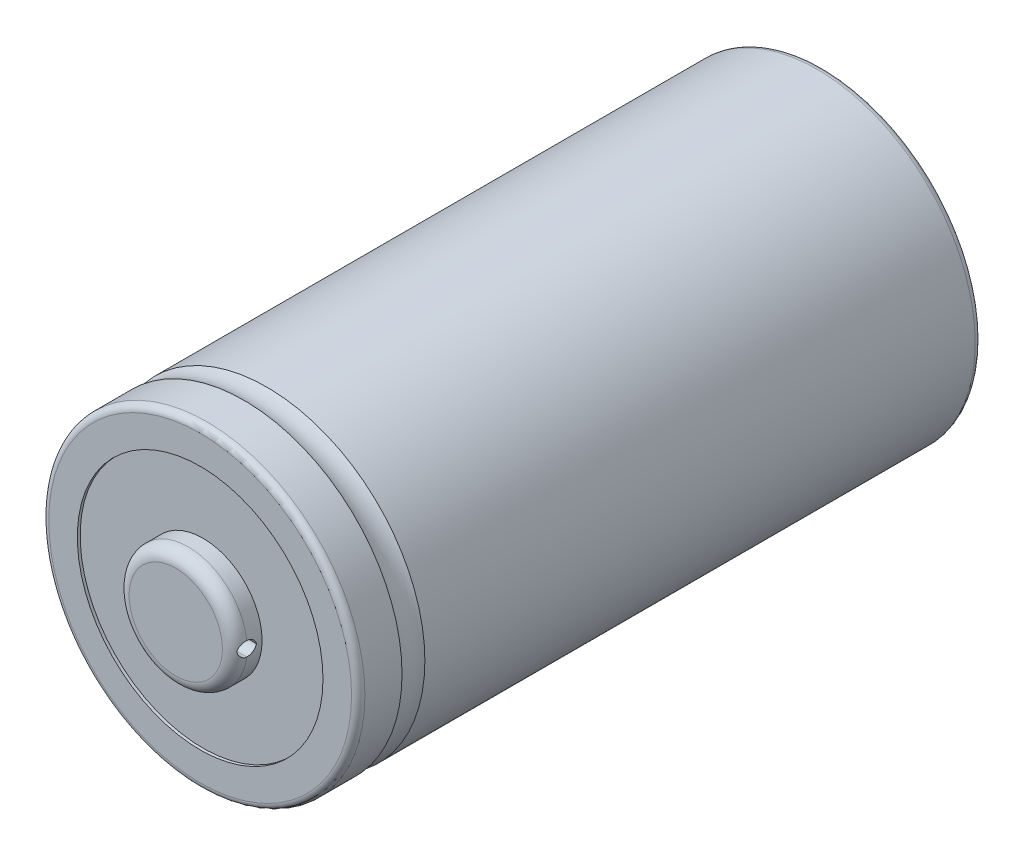
ISO-10303-21;
HEADER;
FILE_DESCRIPTION(('STEP AP214'),'2;1');
FILE_NAME('part.step','',(''),(''),'','','');
FILE_SCHEMA(('AUTOMOTIVE_DESIGN { 1 0 10303 214 1 1 1 1 }'));
ENDSEC;
DATA;
#1=APPLICATION_CONTEXT('core data for automotive mechanical design processes');
#2=APPLICATION_PROTOCOL_DEFINITION('international standard','automotive_design',2000,#1);
#3=PRODUCT_CONTEXT('',#1,'mechanical');
#4=PRODUCT('Part','Part','',(#3));
#5=PRODUCT_RELATED_PRODUCT_CATEGORY('part','',(#4));
#6=PRODUCT_DEFINITION_FORMATION('','',#4);
#7=PRODUCT_DEFINITION_CONTEXT('part definition',#1,'design');
#8=PRODUCT_DEFINITION('design','',#6,#7);
#9=PRODUCT_DEFINITION_SHAPE('','',#8);
#10=(LENGTH_UNIT() NAMED_UNIT(*) SI_UNIT(.MILLI.,.METRE.));
#11=(NAMED_UNIT(*) PLANE_ANGLE_UNIT() SI_UNIT($,.RADIAN.));
#12=(NAMED_UNIT(*) SI_UNIT($,.STERADIAN.) SOLID_ANGLE_UNIT());
#13=UNCERTAINTY_MEASURE_WITH_UNIT(LENGTH_MEASURE(1.E-05),#10,'distance_accuracy_value','');
#14=(GEOMETRIC_REPRESENTATION_CONTEXT(3) GLOBAL_UNCERTAINTY_ASSIGNED_CONTEXT((#13)) GLOBAL_UNIT_ASSIGNED_CONTEXT((#10,
#11,#12)) REPRESENTATION_CONTEXT('',''));
#15=CARTESIAN_POINT('',(0.,0.,0.));
#16=DIRECTION('',(0.,0.,1.));
#17=DIRECTION('',(1.,0.,0.));
#18=AXIS2_PLACEMENT_3D('',#15,#16,#17);
#19=CARTESIAN_POINT('',(0.,0.,44.0781240867132));
#20=DIRECTION('',(0.,0.,-1.));
#21=DIRECTION('',(-1.,0.,0.));
#22=AXIS2_PLACEMENT_3D('',#19,#20,#21);
#23=CYLINDRICAL_SURFACE('',#22,3.1);
#24=CARTESIAN_POINT('',(0.,0.,33.38));
#25=DIRECTION('',(0.,0.,1.));
#26=DIRECTION('',(1.,0.,0.));
#27=AXIS2_PLACEMENT_3D('',#24,#25,#26);
#28=CIRCLE('',#27,3.1);
#29=CARTESIAN_POINT('',(3.07723496015498,-0.375000000000001,33.38));
#30=VERTEX_POINT('',#29);
#31=CARTESIAN_POINT('',(-3.07723496015498,-0.375000000000001,33.38));
#32=VERTEX_POINT('',#31);
#33=EDGE_CURVE('E106',#30,#32,#28,.F.);
#34=ORIENTED_EDGE('',*,*,#33,.T.);
#35=CARTESIAN_POINT('',(-3.07723496015498,-0.375000000000001,33.38));
#36=CARTESIAN_POINT('',(-3.07722108964524,-0.37502431119088,33.3519675359304));
#37=CARTESIAN_POINT('',(-3.07752190263624,-0.372644060289489,33.32394489367));
#38=CARTESIAN_POINT('',(-3.07864973757918,-0.36325722162575,33.2687270510573));
#39=CARTESIAN_POINT('',(-3.07947617231636,-0.35625579622366,33.2415309627748));
#40=CARTESIAN_POINT('',(-3.08155286971449,-0.337805540782092,33.1886991276051));
#41=CARTESIAN_POINT('',(-3.0828032752883,-0.326355210907788,33.1630639103005));
#42=CARTESIAN_POINT('',(-3.08554349645924,-0.299342894087063,33.1140770740933));
#43=CARTESIAN_POINT('',(-3.08703330170583,-0.283781084883623,33.0907253565327));
#44=CARTESIAN_POINT('',(-3.09004176139488,-0.248894857892252,33.0468452198899));
#45=CARTESIAN_POINT('',(-3.09156051895574,-0.229552992853834,33.0263306760024));
#46=CARTESIAN_POINT('',(-3.0943840028743,-0.187688391438738,32.988827773696));
#47=CARTESIAN_POINT('',(-3.09568869525859,-0.165165151212497,32.971839974879));
#48=CARTESIAN_POINT('',(-3.09786210989986,-0.117551002107083,32.9418660448252));
#49=CARTESIAN_POINT('',(-3.09873044168488,-0.0924578176254112,32.9288835016384));
#50=CARTESIAN_POINT('',(-3.09984507875116,-0.0404388430265554,32.9073253160016));
#51=CARTESIAN_POINT('',(-3.1000917758696,-0.0135142183264924,32.8987469001993));
#52=CARTESIAN_POINT('',(-3.09988702075,0.0321442171049149,32.8883417535016));
#53=CARTESIAN_POINT('',(-3.09964213798515,0.0505933875030443,32.8852152181896));
#54=CARTESIAN_POINT('',(-3.09881544336478,0.0876947316520287,32.8810441442412));
#55=CARTESIAN_POINT('',(-3.09823405235983,0.106346623333572,32.8799970122551));
#56=CARTESIAN_POINT('',(-3.09747881348687,0.124999999999999,32.88));
#57=B_SPLINE_CURVE_WITH_KNOTS('',3,(#35,#36,#37,#38,#39,#40,#41,#42,#43,#44,#45,#46,#47,#48,#49,
#50,#51,#52,#53,#54,#55,#56),.UNSPECIFIED.,.F.,.F.,(4,2,2,2,2,2,2,2,2,2,4),(0.,
0.0839803673878672,0.167867077891062,0.251782093234397,0.335693481448919,0.4200017304861,
0.504323346825369,0.588720283570846,0.673064008773517,0.729093206450725,0.785052482732773),.UNSPECIFIED.);
#58=CARTESIAN_POINT('',(-3.10000000000004,5.42671774380772E-13,32.895877081724));
#59=VERTEX_POINT('',#58);
#60=EDGE_CURVE('E14',#32,#59,#57,.T.);
#61=ORIENTED_EDGE('',*,*,#60,.T.);
#62=CARTESIAN_POINT('',(-3.09747881348687,-0.125000000000001,32.88));
#63=CARTESIAN_POINT('',(-3.09861651009824,-0.0971623136353558,32.8799746789222));
#64=CARTESIAN_POINT('',(-3.0993504478092,-0.0693169063857497,32.8823233265536));
#65=CARTESIAN_POINT('',(-3.10008403812204,-0.0144214692714766,32.8915949882362));
#66=CARTESIAN_POINT('',(-3.10008457103918,0.0126294751774171,32.8985125082277));
#67=CARTESIAN_POINT('',(-3.09942683113484,0.0652061208349664,32.9167527016929));
#68=CARTESIAN_POINT('',(-3.09876829775109,0.0907312145679851,32.9280771163529));
#69=CARTESIAN_POINT('',(-3.09695440912784,0.139529820426052,32.9547972721709));
#70=CARTESIAN_POINT('',(-3.09579907639678,0.162803434500159,32.9701928288658));
#71=CARTESIAN_POINT('',(-3.09318789324821,0.206574848877496,33.0047144602662));
#72=CARTESIAN_POINT('',(-3.09173050957152,0.227057566723044,33.0238595397373));
#73=CARTESIAN_POINT('',(-3.08874907732761,0.264543975757543,33.0652998292728));
#74=CARTESIAN_POINT('',(-3.08722501473765,0.281546930833944,33.0875957041769));
#75=CARTESIAN_POINT('',(-3.08432630891288,0.311710421023912,33.1348942164361));
#76=CARTESIAN_POINT('',(-3.08295286659649,0.324841311337272,33.1599158252033));
#77=CARTESIAN_POINT('',(-3.08057070689916,0.346707029091669,33.211820530607));
#78=CARTESIAN_POINT('',(-3.07956177339674,0.355444462672146,33.2387025129021));
#79=CARTESIAN_POINT('',(-3.07829504603471,0.366222709143249,33.2847741958251));
#80=CARTESIAN_POINT('',(-3.0779002591024,0.369511132572404,33.30367780474));
#81=CARTESIAN_POINT('',(-3.07736900719374,0.373900120727669,33.3417181781828));
#82=CARTESIAN_POINT('',(-3.07723223850545,0.375003257819717,33.3608546418681));
#83=CARTESIAN_POINT('',(-3.07723496015498,0.374999999999999,33.38));
#84=B_SPLINE_CURVE_WITH_KNOTS('',3,(#62,#63,#64,#65,#66,#67,#68,#69,#70,#71,#72,#73,#74,#75,#76,
#77,#78,#79,#80,#81,#82,#83),.UNSPECIFIED.,.F.,.F.,(4,2,2,2,2,2,2,2,2,2,4),(0.,
0.0834682744861935,0.166836360835152,0.250237419834706,0.333634700588622,0.417466169679393,
0.501315354275548,0.585790751923024,0.670215980611678,0.727670408798062,0.785057165374741),.UNSPECIFIED.);
#85=CARTESIAN_POINT('',(-3.07723496015499,0.374999999999999,33.38));
#86=VERTEX_POINT('',#85);
#87=EDGE_CURVE('E111',#59,#86,#84,.T.);
#88=ORIENTED_EDGE('',*,*,#87,.T.);
#89=CARTESIAN_POINT('',(3.07723496015503,0.374999999999999,33.38));
#90=VERTEX_POINT('',#89);
#91=EDGE_CURVE('E130',#86,#90,#28,.F.);
#92=ORIENTED_EDGE('',*,*,#91,.T.);
#93=CARTESIAN_POINT('',(3.07723496015498,0.374999999999999,33.38));
#94=CARTESIAN_POINT('',(3.07722108964524,0.375024311190879,33.3519675359304));
#95=CARTESIAN_POINT('',(3.07752190263624,0.372644060289488,33.32394489367));
#96=CARTESIAN_POINT('',(3.07864973757918,0.363257221625748,33.2687270510573));
#97=CARTESIAN_POINT('',(3.07947617231636,0.356255796223658,33.2415309627748));
#98=CARTESIAN_POINT('',(3.08155286971449,0.337805540782091,33.1886991276051));
#99=CARTESIAN_POINT('',(3.0828032752883,0.326355210907786,33.1630639103005));
#100=CARTESIAN_POINT('',(3.08554349645924,0.299342894087061,33.1140770740933));
#101=CARTESIAN_POINT('',(3.08703330170583,0.283781084883622,33.0907253565327));
#102=CARTESIAN_POINT('',(3.09004176139488,0.248894857892251,33.0468452198899));
#103=CARTESIAN_POINT('',(3.09156051895574,0.229552992853832,33.0263306760024));
#104=CARTESIAN_POINT('',(3.0943840028743,0.187688391438736,32.988827773696));
#105=CARTESIAN_POINT('',(3.09568869525859,0.165165151212495,32.971839974879));
#106=CARTESIAN_POINT('',(3.09786210989986,0.117551002107082,32.9418660448252));
#107=CARTESIAN_POINT('',(3.09873044168488,0.0924578176254095,32.9288835016384));
#108=CARTESIAN_POINT('',(3.09984507875116,0.0404388430265537,32.9073253160016));
#109=CARTESIAN_POINT('',(3.1000917758696,0.0135142183264907,32.8987469001993));
#110=CARTESIAN_POINT('',(3.09988702075,-0.0321442171049166,32.8883417535016));
#111=CARTESIAN_POINT('',(3.09964213798515,-0.050593387503046,32.8852152181896));
#112=CARTESIAN_POINT('',(3.09881544336478,-0.0876947316520304,32.8810441442412));
#113=CARTESIAN_POINT('',(3.09823405235983,-0.106346623333573,32.8799970122551));
#114=CARTESIAN_POINT('',(3.09747881348687,-0.125,32.88));
#115=B_SPLINE_CURVE_WITH_KNOTS('',3,(#93,#94,#95,#96,#97,#98,#99,#100,#101,#102,#103,#104,#105,
#106,#107,#108,#109,#110,#111,#112,#113,#114),.UNSPECIFIED.,.F.,.F.,(4,2,2,2,2,2,2,2,2,2,4),(0.,
0.0839803673878672,0.167867077891062,0.251782093234397,0.335693481448919,0.4200017304861,
0.504323346825369,0.588720283570846,0.673064008773517,0.729093206450725,0.785052482732773),.UNSPECIFIED.);
#116=CARTESIAN_POINT('',(3.1,0.,32.8958770817241));
#117=VERTEX_POINT('',#116);
#118=EDGE_CURVE('E87',#90,#117,#115,.T.);
#119=ORIENTED_EDGE('',*,*,#118,.T.);
#120=CARTESIAN_POINT('',(3.09747881348687,0.124999999999999,32.88));
#121=CARTESIAN_POINT('',(3.09861651009824,0.0971623136353541,32.8799746789222));
#122=CARTESIAN_POINT('',(3.0993504478092,0.069316906385748,32.8823233265536));
#123=CARTESIAN_POINT('',(3.10008403812204,0.0144214692714749,32.8915949882362));
#124=CARTESIAN_POINT('',(3.10008457103918,-0.0126294751774188,32.8985125082277));
#125=CARTESIAN_POINT('',(3.09942683113484,-0.0652061208349681,32.9167527016929));
#126=CARTESIAN_POINT('',(3.09876829775109,-0.0907312145679868,32.9280771163529));
#127=CARTESIAN_POINT('',(3.09695440912784,-0.139529820426054,32.9547972721709));
#128=CARTESIAN_POINT('',(3.09579907639678,-0.162803434500161,32.9701928288658));
#129=CARTESIAN_POINT('',(3.09318789324821,-0.206574848877497,33.0047144602662));
#130=CARTESIAN_POINT('',(3.09173050957152,-0.227057566723045,33.0238595397373));
#131=CARTESIAN_POINT('',(3.08874907732761,-0.264543975757544,33.0652998292728));
#132=CARTESIAN_POINT('',(3.08722501473765,-0.281546930833945,33.0875957041769));
#133=CARTESIAN_POINT('',(3.08432630891288,-0.311710421023914,33.1348942164361));
#134=CARTESIAN_POINT('',(3.08295286659649,-0.324841311337273,33.1599158252033));
#135=CARTESIAN_POINT('',(3.08057070689916,-0.34670702909167,33.211820530607));
#136=CARTESIAN_POINT('',(3.07956177339674,-0.355444462672147,33.2387025129021));
#137=CARTESIAN_POINT('',(3.07829504603471,-0.366222709143251,33.2847741958251));
#138=CARTESIAN_POINT('',(3.0779002591024,-0.369511132572406,33.30367780474));
#139=CARTESIAN_POINT('',(3.07736900719374,-0.373900120727671,33.3417181781828));
#140=CARTESIAN_POINT('',(3.07723223850545,-0.375003257819719,33.3608546418681));
#141=CARTESIAN_POINT('',(3.07723496015498,-0.375000000000001,33.38));
#142=B_SPLINE_CURVE_WITH_KNOTS('',3,(#120,#121,#122,#123,#124,#125,#126,#127,#128,#129,#130,
#131,#132,#133,#134,#135,#136,#137,#138,#139,#140,#141),.UNSPECIFIED.,.F.,.F.,(4,2,2,2,2,2,2,2,
2,2,4),(0.,0.0834682744861935,0.166836360835152,0.250237419834706,0.333634700588622,
0.417466169679393,0.501315354275548,0.585790751923024,0.670215980611678,0.727670408798062,
0.785057165374741),.UNSPECIFIED.);
#143=EDGE_CURVE('E75',#117,#30,#142,.T.);
#144=ORIENTED_EDGE('',*,*,#143,.T.);
#145=EDGE_LOOP('',(#34,#61,#88,#92,#119,#144));
#146=FACE_BOUND('',#145,.T.);
#147=CARTESIAN_POINT('',(0.,0.,32.6));
#148=DIRECTION('',(0.,0.,1.));
#149=DIRECTION('',(1.,0.,0.));
#150=AXIS2_PLACEMENT_3D('',#147,#148,#149);
#151=CIRCLE('',#150,3.1);
#152=CARTESIAN_POINT('',(3.1,0.,32.6));
#153=VERTEX_POINT('',#152);
#154=EDGE_CURVE('E213',#153,#153,#151,.T.);
#155=ORIENTED_EDGE('',*,*,#154,.T.);
#156=EDGE_LOOP('',(#155));
#157=FACE_BOUND('',#156,.T.);
#158=ADVANCED_FACE('F65',(#146,#157),#23,.T.);
#159=CARTESIAN_POINT('',(0.,0.,32.6));
#160=DIRECTION('',(0.,0.,1.));
#161=DIRECTION('',(1.,0.,0.));
#162=AXIS2_PLACEMENT_3D('',#159,#160,#161);
#163=PLANE('',#162);
#164=ORIENTED_EDGE('',*,*,#154,.F.);
#165=EDGE_LOOP('',(#164));
#166=FACE_BOUND('',#165,.T.);
#167=ADVANCED_FACE('F197',(#166),#163,.F.);
#168=CARTESIAN_POINT('',(0.,0.,34.03));
#169=DIRECTION('',(0.,0.,1.));
#170=DIRECTION('',(1.,0.,0.));
#171=AXIS2_PLACEMENT_3D('',#168,#169,#170);
#172=PLANE('',#171);
#173=CARTESIAN_POINT('',(0.,0.,34.03));
#174=DIRECTION('',(0.,0.,1.));
#175=DIRECTION('',(1.,0.,0.));
#176=AXIS2_PLACEMENT_3D('',#173,#174,#175);
#177=CIRCLE('',#176,2.45);
#178=CARTESIAN_POINT('',(2.45,0.,34.03));
#179=VERTEX_POINT('',#178);
#180=EDGE_CURVE('E214',#179,#179,#177,.T.);
#181=ORIENTED_EDGE('',*,*,#180,.T.);
#182=EDGE_LOOP('',(#181));
#183=FACE_BOUND('',#182,.T.);
#184=ADVANCED_FACE('F154',(#183),#172,.T.);
#185=CARTESIAN_POINT('',(0.,0.,33.38));
#186=DIRECTION('',(0.,0.,1.));
#187=DIRECTION('',(1.,0.,0.));
#188=AXIS2_PLACEMENT_3D('',#185,#186,#187);
#189=TOROIDAL_SURFACE('',#188,2.45,0.65);
#190=ORIENTED_EDGE('',*,*,#91,.F.);
#191=CARTESIAN_POINT('',(-3.07723496015499,0.374999999999999,33.38));
#192=CARTESIAN_POINT('',(-3.0772590507192,0.375024823588249,33.401064686639));
#193=CARTESIAN_POINT('',(-3.07640744153031,0.373337950315937,33.4221032987817));
#194=CARTESIAN_POINT('',(-3.07314125702718,0.366747756603703,33.4634539921918));
#195=CARTESIAN_POINT('',(-3.07073361086126,0.36185869445875,33.4837688751525));
#196=CARTESIAN_POINT('',(-3.06454372897254,0.349073939244649,33.523175498742));
#197=CARTESIAN_POINT('',(-3.06076280754444,0.341181120580212,33.5422683883994));
#198=CARTESIAN_POINT('',(-3.05213509365533,0.322682969406967,33.578838329204));
#199=CARTESIAN_POINT('',(-3.04728742575331,0.312075407832498,33.5963140363557));
#200=CARTESIAN_POINT('',(-3.03660375612171,0.28778723211792,33.6302477306299));
#201=CARTESIAN_POINT('',(-3.03072747222377,0.273967208361113,33.6465929966448));
#202=CARTESIAN_POINT('',(-3.01869499053535,0.243955787853043,33.6768459721595));
#203=CARTESIAN_POINT('',(-3.01253849026637,0.227761784550943,33.6907509649694));
#204=CARTESIAN_POINT('',(-2.99997854541977,0.191740547747157,33.7169922283487));
#205=CARTESIAN_POINT('',(-2.99360275145199,0.171717488329132,33.7290746459123));
#206=CARTESIAN_POINT('',(-2.98205864838753,0.129623560367935,33.7496460750387));
#207=CARTESIAN_POINT('',(-2.97688726286513,0.107558114963935,33.7581442878495));
#208=CARTESIAN_POINT('',(-2.96957551308347,0.0671258078864857,33.7696754911881));
#209=CARTESIAN_POINT('',(-2.967012642919,0.0490652112247237,33.773513401851));
#210=CARTESIAN_POINT('',(-2.96340407662236,0.0123540007983645,33.7786897300325));
#211=CARTESIAN_POINT('',(-2.96236598690248,-0.00629909997052142,33.7800156257431));
#212=CARTESIAN_POINT('',(-2.9622420457586,-0.0249999999999984,33.78));
#213=B_SPLINE_CURVE_WITH_KNOTS('',3,(#191,#192,#193,#194,#195,#196,#197,#198,#199,#200,#201,
#202,#203,#204,#205,#206,#207,#208,#209,#210,#211,#212),.UNSPECIFIED.,.F.,.F.,(4,2,2,2,2,2,2,2,
2,2,4),(0.,0.0630684694461883,0.125858007565663,0.188587610547441,0.251368886764664,
0.317685398495476,0.384075276614335,0.456440856219382,0.528619513629262,0.58431320872704,
0.640283800848986),.UNSPECIFIED.);
#214=CARTESIAN_POINT('',(-2.96295711321828,-1.93028947010796E-11,33.7792179855656));
#215=VERTEX_POINT('',#214);
#216=EDGE_CURVE('E159',#86,#215,#213,.T.);
#217=ORIENTED_EDGE('',*,*,#216,.T.);
#218=CARTESIAN_POINT('',(-2.9622420457586,0.0249999999999991,33.78));
#219=CARTESIAN_POINT('',(-2.96236776154865,0.0041508070441296,33.7800242912142));
#220=CARTESIAN_POINT('',(-2.96364620008122,-0.0166322823187571,33.7783722477045));
#221=CARTESIAN_POINT('',(-2.96806276316335,-0.0573686676837246,33.7719592414631));
#222=CARTESIAN_POINT('',(-2.97118787803089,-0.0773267335301356,33.7672200040728));
#223=CARTESIAN_POINT('',(-2.97885477573924,-0.115965605616805,33.7548881428554));
#224=CARTESIAN_POINT('',(-2.98339246544792,-0.134649914458808,33.747303750404));
#225=CARTESIAN_POINT('',(-2.99332529995938,-0.170524159135407,33.7295305248176));
#226=CARTESIAN_POINT('',(-2.99872214287593,-0.187711028954692,33.7193365089853));
#227=CARTESIAN_POINT('',(-3.01040847829504,-0.221974378088852,33.6954103445415));
#228=CARTESIAN_POINT('',(-3.01673291270941,-0.238861489826141,33.6814236496848));
#229=CARTESIAN_POINT('',(-3.02914686668606,-0.270175412685932,33.6508330598623));
#230=CARTESIAN_POINT('',(-3.03523636240873,-0.284601974637972,33.634228900163));
#231=CARTESIAN_POINT('',(-3.04699632334387,-0.311480644974977,33.5975540855449));
#232=CARTESIAN_POINT('',(-3.05261500608103,-0.323747227159621,33.5773295610169));
#233=CARTESIAN_POINT('',(-3.0623817059394,-0.344608506917349,33.534757137163));
#234=CARTESIAN_POINT('',(-3.06653185876548,-0.353208540569314,33.5124123818402));
#235=CARTESIAN_POINT('',(-3.07216793075783,-0.36477294799791,33.4717221940472));
#236=CARTESIAN_POINT('',(-3.07405061935064,-0.368586467358285,33.4536696973741));
#237=CARTESIAN_POINT('',(-3.07659238127824,-0.373709732064341,33.4170856546874));
#238=CARTESIAN_POINT('',(-3.07724846839099,-0.375013367201711,33.3985530506364));
#239=CARTESIAN_POINT('',(-3.07723496015498,-0.375000000000001,33.38));
#240=B_SPLINE_CURVE_WITH_KNOTS('',3,(#218,#219,#220,#221,#222,#223,#224,#225,#226,#227,#228,
#229,#230,#231,#232,#233,#234,#235,#236,#237,#238,#239),.UNSPECIFIED.,.F.,.F.,(4,2,2,2,2,2,2,2,
2,2,4),(0.,0.0623656226013925,0.124297036380257,0.186050639925231,0.247927850326597,
0.316104472169852,0.38428799390485,0.456836509577251,0.529279078981418,0.584711160322038,
0.640278018956382),.UNSPECIFIED.);
#241=EDGE_CURVE('E124',#215,#32,#240,.T.);
#242=ORIENTED_EDGE('',*,*,#241,.T.);
#243=ORIENTED_EDGE('',*,*,#33,.F.);
#244=CARTESIAN_POINT('',(3.07723496015498,-0.375000000000001,33.38));
#245=CARTESIAN_POINT('',(3.07725905071919,-0.375024823588251,33.401064686639));
#246=CARTESIAN_POINT('',(3.07640744153031,-0.373337950315939,33.4221032987817));
#247=CARTESIAN_POINT('',(3.07314125702718,-0.366747756603704,33.4634539921918));
#248=CARTESIAN_POINT('',(3.07073361086126,-0.361858694458751,33.4837688751525));
#249=CARTESIAN_POINT('',(3.06454372897254,-0.349073939244651,33.523175498742));
#250=CARTESIAN_POINT('',(3.06076280754444,-0.341181120580214,33.5422683883994));
#251=CARTESIAN_POINT('',(3.05213509365533,-0.322682969406969,33.578838329204));
#252=CARTESIAN_POINT('',(3.04728742575331,-0.3120754078325,33.5963140363557));
#253=CARTESIAN_POINT('',(3.03660375612171,-0.287787232117922,33.6302477306299));
#254=CARTESIAN_POINT('',(3.03072747222377,-0.273967208361114,33.6465929966448));
#255=CARTESIAN_POINT('',(3.01869499053535,-0.243955787853045,33.6768459721595));
#256=CARTESIAN_POINT('',(3.01253849026637,-0.227761784550944,33.6907509649694));
#257=CARTESIAN_POINT('',(2.99997854541977,-0.191740547747158,33.7169922283487));
#258=CARTESIAN_POINT('',(2.99360275145199,-0.171717488329134,33.7290746459123));
#259=CARTESIAN_POINT('',(2.98205864838753,-0.129623560367936,33.7496460750387));
#260=CARTESIAN_POINT('',(2.97688726286513,-0.107558114963936,33.7581442878495));
#261=CARTESIAN_POINT('',(2.96957551308347,-0.0671258078864865,33.7696754911881));
#262=CARTESIAN_POINT('',(2.967012642919,-0.049065211224724,33.773513401851));
#263=CARTESIAN_POINT('',(2.96340407662236,-0.0123540007983654,33.7786897300325));
#264=CARTESIAN_POINT('',(2.96236598690248,0.0062990999705196,33.7800156257431));
#265=CARTESIAN_POINT('',(2.9622420457586,0.0249999999999967,33.78));
#266=B_SPLINE_CURVE_WITH_KNOTS('',3,(#244,#245,#246,#247,#248,#249,#250,#251,#252,#253,#254,
#255,#256,#257,#258,#259,#260,#261,#262,#263,#264,#265),.UNSPECIFIED.,.F.,.F.,(4,2,2,2,2,2,2,2,
2,2,4),(0.,0.0630684694461877,0.125858007565663,0.188587610547441,0.251368886764663,
0.317685398495476,0.384075276614335,0.456440856219382,0.528619513629261,0.584313208727042,
0.640283800848986),.UNSPECIFIED.);
#267=CARTESIAN_POINT('',(2.96295711321734,0.,33.7792179855668));
#268=VERTEX_POINT('',#267);
#269=EDGE_CURVE('E115',#30,#268,#266,.T.);
#270=ORIENTED_EDGE('',*,*,#269,.T.);
#271=CARTESIAN_POINT('',(2.9622420457586,-0.0250000000000008,33.78));
#272=CARTESIAN_POINT('',(2.96236776154865,-0.0041508070441314,33.7800242912142));
#273=CARTESIAN_POINT('',(2.96364620008122,0.0166322823187554,33.7783722477045));
#274=CARTESIAN_POINT('',(2.96806276316335,0.0573686676837229,33.7719592414631));
#275=CARTESIAN_POINT('',(2.97118787803089,0.077326733530134,33.7672200040728));
#276=CARTESIAN_POINT('',(2.97885477573924,0.115965605616803,33.7548881428554));
#277=CARTESIAN_POINT('',(2.98339246544792,0.134649914458807,33.747303750404));
#278=CARTESIAN_POINT('',(2.99332529995938,0.170524159135405,33.7295305248176));
#279=CARTESIAN_POINT('',(2.99872214287593,0.187711028954691,33.7193365089853));
#280=CARTESIAN_POINT('',(3.01040847829504,0.22197437808885,33.6954103445415));
#281=CARTESIAN_POINT('',(3.01673291270941,0.238861489826139,33.6814236496848));
#282=CARTESIAN_POINT('',(3.02914686668606,0.27017541268593,33.6508330598623));
#283=CARTESIAN_POINT('',(3.03523636240873,0.28460197463797,33.634228900163));
#284=CARTESIAN_POINT('',(3.04699632334387,0.311480644974975,33.5975540855449));
#285=CARTESIAN_POINT('',(3.05261500608103,0.323747227159619,33.5773295610169));
#286=CARTESIAN_POINT('',(3.0623817059394,0.344608506917347,33.534757137163));
#287=CARTESIAN_POINT('',(3.06653185876548,0.353208540569313,33.5124123818402));
#288=CARTESIAN_POINT('',(3.07216793075783,0.364772947997908,33.4717221940472));
#289=CARTESIAN_POINT('',(3.07405061935064,0.368586467358284,33.4536696973741));
#290=CARTESIAN_POINT('',(3.07659238127825,0.37370973206434,33.4170856546874));
#291=CARTESIAN_POINT('',(3.07724846839099,0.37501336720171,33.3985530506364));
#292=CARTESIAN_POINT('',(3.07723496015498,0.374999999999999,33.38));
#293=B_SPLINE_CURVE_WITH_KNOTS('',3,(#271,#272,#273,#274,#275,#276,#277,#278,#279,#280,#281,
#282,#283,#284,#285,#286,#287,#288,#289,#290,#291,#292),.UNSPECIFIED.,.F.,.F.,(4,2,2,2,2,2,2,2,
2,2,4),(0.,0.0623656226013926,0.124297036380257,0.186050639925231,0.247927850326598,
0.316104472169852,0.38428799390485,0.456836509577251,0.529279078981418,0.584711160322045,
0.640278018956389),.UNSPECIFIED.);
#294=EDGE_CURVE('E166',#268,#90,#293,.T.);
#295=ORIENTED_EDGE('',*,*,#294,.T.);
#296=EDGE_LOOP('',(#190,#217,#242,#243,#270,#295));
#297=FACE_BOUND('',#296,.T.);
#298=ORIENTED_EDGE('',*,*,#180,.F.);
#299=EDGE_LOOP('',(#298));
#300=FACE_BOUND('',#299,.T.);
#301=ADVANCED_FACE('F128',(#297,#300),#189,.T.);
#302=CARTESIAN_POINT('',(-8.3,-0.0250000000000008,33.38));
#303=DIRECTION('',(-1.,0.,0.));
#304=DIRECTION('',(0.,0.,1.));
#305=AXIS2_PLACEMENT_3D('',#302,#303,#304);
#306=CYLINDRICAL_SURFACE('',#305,0.4);
#307=DIRECTION('',(-1.,0.,0.));
#308=VECTOR('',#307,1.);
#309=CARTESIAN_POINT('',(0.,0.,33.7792179855668));
#310=LINE('',#309,#308);
#311=EDGE_CURVE('E120',#215,#268,#310,.F.);
#312=ORIENTED_EDGE('',*,*,#311,.F.);
#313=ORIENTED_EDGE('',*,*,#216,.F.);
#314=DIRECTION('',(1.,0.,0.));
#315=VECTOR('',#314,1.);
#316=CARTESIAN_POINT('',(-2.93851628167349,0.374999999999999,33.38));
#317=LINE('',#316,#315);
#318=EDGE_CURVE('E125',#90,#86,#317,.F.);
#319=ORIENTED_EDGE('',*,*,#318,.F.);
#320=ORIENTED_EDGE('',*,*,#294,.F.);
#321=EDGE_LOOP('',(#312,#313,#319,#320));
#322=FACE_BOUND('',#321,.T.);
#323=ADVANCED_FACE('F153',(#322),#306,.F.);
#324=CARTESIAN_POINT('',(-8.3,0.0249999999999991,33.38));
#325=DIRECTION('',(-1.,0.,0.));
#326=DIRECTION('',(0.,0.,1.));
#327=AXIS2_PLACEMENT_3D('',#324,#325,#326);
#328=CYLINDRICAL_SURFACE('',#327,0.4);
#329=ORIENTED_EDGE('',*,*,#241,.F.);
#330=ORIENTED_EDGE('',*,*,#311,.T.);
#331=ORIENTED_EDGE('',*,*,#269,.F.);
#332=DIRECTION('',(1.,0.,0.));
#333=VECTOR('',#332,1.);
#334=CARTESIAN_POINT('',(2.93851628167347,-0.375000000000001,33.38));
#335=LINE('',#334,#333);
#336=EDGE_CURVE('E118',#32,#30,#335,.T.);
#337=ORIENTED_EDGE('',*,*,#336,.F.);
#338=EDGE_LOOP('',(#329,#330,#331,#337));
#339=FACE_BOUND('',#338,.T.);
#340=ADVANCED_FACE('F117',(#339),#328,.F.);
#341=CARTESIAN_POINT('',(-8.3,0.124999999999999,33.38));
#342=DIRECTION('',(-1.,0.,0.));
#343=DIRECTION('',(0.,0.,1.));
#344=AXIS2_PLACEMENT_3D('',#341,#342,#343);
#345=CYLINDRICAL_SURFACE('',#344,0.5);
#346=DIRECTION('',(-1.,0.,0.));
#347=VECTOR('',#346,1.);
#348=CARTESIAN_POINT('',(0.,0.,32.8958770817241));
#349=LINE('',#348,#347);
#350=EDGE_CURVE('E70',#59,#117,#349,.F.);
#351=ORIENTED_EDGE('',*,*,#350,.F.);
#352=ORIENTED_EDGE('',*,*,#60,.F.);
#353=ORIENTED_EDGE('',*,*,#336,.T.);
#354=ORIENTED_EDGE('',*,*,#143,.F.);
#355=EDGE_LOOP('',(#351,#352,#353,#354));
#356=FACE_BOUND('',#355,.T.);
#357=ADVANCED_FACE('F67',(#356),#345,.F.);
#358=CARTESIAN_POINT('',(-8.3,-0.125000000000001,33.38));
#359=DIRECTION('',(-1.,0.,0.));
#360=DIRECTION('',(0.,0.,1.));
#361=AXIS2_PLACEMENT_3D('',#358,#359,#360);
#362=CYLINDRICAL_SURFACE('',#361,0.5);
#363=ORIENTED_EDGE('',*,*,#87,.F.);
#364=ORIENTED_EDGE('',*,*,#350,.T.);
#365=ORIENTED_EDGE('',*,*,#118,.F.);
#366=ORIENTED_EDGE('',*,*,#318,.T.);
#367=EDGE_LOOP('',(#363,#364,#365,#366));
#368=FACE_BOUND('',#367,.T.);
#369=ADVANCED_FACE('F174',(#368),#362,.F.);
#370=CLOSED_SHELL('',(#158,#167,#184,#301,#323,#340,#357,#369));
#371=MANIFOLD_SOLID_BREP('B2',#370);
#372=CARTESIAN_POINT('',(0.,0.,32.75));
#373=DIRECTION('',(0.,0.,-1.));
#374=DIRECTION('',(-1.,0.,0.));
#375=AXIS2_PLACEMENT_3D('',#372,#373,#374);
#376=CYLINDRICAL_SURFACE('',#375,8.3);
#377=CARTESIAN_POINT('',(0.,0.,30.45));
#378=DIRECTION('',(0.,0.,-1.));
#379=DIRECTION('',(-1.,0.,0.));
#380=AXIS2_PLACEMENT_3D('',#377,#378,#379);
#381=CIRCLE('',#380,8.3);
#382=CARTESIAN_POINT('',(8.3,0.,30.45));
#383=VERTEX_POINT('',#382);
#384=EDGE_CURVE('E63',#383,#383,#381,.F.);
#385=ORIENTED_EDGE('',*,*,#384,.T.);
#386=EDGE_LOOP('',(#385));
#387=FACE_BOUND('',#386,.T.);
#388=CARTESIAN_POINT('',(0.,0.,32.4));
#389=DIRECTION('',(0.,0.,1.));
#390=DIRECTION('',(1.,0.,0.));
#391=AXIS2_PLACEMENT_3D('',#388,#389,#390);
#392=CIRCLE('',#391,8.3);
#393=CARTESIAN_POINT('',(8.3,0.,32.4));
#394=VERTEX_POINT('',#393);
#395=EDGE_CURVE('E315',#394,#394,#392,.F.);
#396=ORIENTED_EDGE('',*,*,#395,.T.);
#397=EDGE_LOOP('',(#396));
#398=FACE_BOUND('',#397,.T.);
#399=ADVANCED_FACE('F280',(#387,#398),#376,.T.);
#400=CARTESIAN_POINT('',(0.,0.,32.75));
#401=DIRECTION('',(0.,0.,1.));
#402=DIRECTION('',(1.,0.,0.));
#403=AXIS2_PLACEMENT_3D('',#400,#401,#402);
#404=PLANE('',#403);
#405=CARTESIAN_POINT('',(0.,0.,32.75));
#406=DIRECTION('',(0.,0.,1.));
#407=DIRECTION('',(1.,0.,0.));
#408=AXIS2_PLACEMENT_3D('',#405,#406,#407);
#409=CIRCLE('',#408,7.95);
#410=CARTESIAN_POINT('',(7.95,0.,32.75));
#411=VERTEX_POINT('',#410);
#412=EDGE_CURVE('E330',#411,#411,#409,.T.);
#413=ORIENTED_EDGE('',*,*,#412,.T.);
#414=EDGE_LOOP('',(#413));
#415=FACE_BOUND('',#414,.T.);
#416=CARTESIAN_POINT('',(0.,0.,32.75));
#417=DIRECTION('',(0.,0.,1.));
#418=DIRECTION('',(1.,0.,0.));
#419=AXIS2_PLACEMENT_3D('',#416,#417,#418);
#420=CIRCLE('',#419,6.45);
#421=CARTESIAN_POINT('',(6.45,0.,32.75));
#422=VERTEX_POINT('',#421);
#423=EDGE_CURVE('E300',#422,#422,#420,.T.);
#424=ORIENTED_EDGE('',*,*,#423,.F.);
#425=EDGE_LOOP('',(#424));
#426=FACE_BOUND('',#425,.T.);
#427=ADVANCED_FACE('F353',(#415,#426),#404,.T.);
#428=CARTESIAN_POINT('',(0.,0.,32.6));
#429=DIRECTION('',(0.,0.,1.));
#430=DIRECTION('',(1.,0.,0.));
#431=AXIS2_PLACEMENT_3D('',#428,#429,#430);
#432=CYLINDRICAL_SURFACE('',#431,6.45);
#433=CARTESIAN_POINT('',(0.,0.,32.6));
#434=DIRECTION('',(0.,0.,1.));
#435=DIRECTION('',(1.,0.,0.));
#436=AXIS2_PLACEMENT_3D('',#433,#434,#435);
#437=CIRCLE('',#436,6.45);
#438=CARTESIAN_POINT('',(6.45,0.,32.6));
#439=VERTEX_POINT('',#438);
#440=EDGE_CURVE('E304',#439,#439,#437,.T.);
#441=ORIENTED_EDGE('',*,*,#440,.F.);
#442=EDGE_LOOP('',(#441));
#443=FACE_BOUND('',#442,.T.);
#444=ORIENTED_EDGE('',*,*,#423,.T.);
#445=EDGE_LOOP('',(#444));
#446=FACE_BOUND('',#445,.T.);
#447=ADVANCED_FACE('F358',(#443,#446),#432,.F.);
#448=CARTESIAN_POINT('',(0.,0.,32.6));
#449=DIRECTION('',(0.,0.,1.));
#450=DIRECTION('',(1.,0.,0.));
#451=AXIS2_PLACEMENT_3D('',#448,#449,#450);
#452=PLANE('',#451);
#453=ORIENTED_EDGE('',*,*,#440,.T.);
#454=EDGE_LOOP('',(#453));
#455=FACE_BOUND('',#454,.T.);
#456=ADVANCED_FACE('F372',(#455),#452,.T.);
#457=CARTESIAN_POINT('',(0.,0.,32.4));
#458=DIRECTION('',(0.,0.,1.));
#459=DIRECTION('',(1.,0.,0.));
#460=AXIS2_PLACEMENT_3D('',#457,#458,#459);
#461=TOROIDAL_SURFACE('',#460,7.95,0.35);
#462=ORIENTED_EDGE('',*,*,#395,.F.);
#463=EDGE_LOOP('',(#462));
#464=FACE_BOUND('',#463,.T.);
#465=ORIENTED_EDGE('',*,*,#412,.F.);
#466=EDGE_LOOP('',(#465));
#467=FACE_BOUND('',#466,.T.);
#468=ADVANCED_FACE('F282',(#464,#467),#461,.T.);
#469=CARTESIAN_POINT('',(0.,0.,29.85));
#470=DIRECTION('',(0.,0.,1.));
#471=DIRECTION('',(1.,0.,0.));
#472=AXIS2_PLACEMENT_3D('',#469,#470,#471);
#473=TOROIDAL_SURFACE('',#472,9.6775,1.5025);
#474=CARTESIAN_POINT('',(9.6775,0.,29.85));
#475=DIRECTION('',(0.,1.,0.));
#476=DIRECTION('',(0.,0.,1.));
#477=AXIS2_PLACEMENT_3D('',#474,#475,#476);
#478=CIRCLE('',#477,1.5025);
#479=CARTESIAN_POINT('',(8.3,0.,29.25));
#480=VERTEX_POINT('',#479);
#481=EDGE_CURVE('E296',#480,#383,#478,.T.);
#482=ORIENTED_EDGE('',*,*,#481,.F.);
#483=CARTESIAN_POINT('',(0.,0.,29.25));
#484=DIRECTION('',(0.,0.,1.));
#485=DIRECTION('',(1.,0.,0.));
#486=AXIS2_PLACEMENT_3D('',#483,#484,#485);
#487=CIRCLE('',#486,8.3);
#488=EDGE_CURVE('E289',#480,#480,#487,.F.);
#489=ORIENTED_EDGE('',*,*,#488,.F.);
#490=ORIENTED_EDGE('',*,*,#481,.T.);
#491=ORIENTED_EDGE('',*,*,#384,.F.);
#492=EDGE_LOOP('',(#482,#489,#490,#491));
#493=FACE_BOUND('',#492,.T.);
#494=ADVANCED_FACE('F297',(#493),#473,.F.);
#495=CARTESIAN_POINT('',(0.,0.,0.15));
#496=DIRECTION('',(0.,0.,-1.));
#497=DIRECTION('',(-1.,0.,0.));
#498=AXIS2_PLACEMENT_3D('',#495,#496,#497);
#499=PLANE('',#498);
#500=CARTESIAN_POINT('',(0.,0.,0.15));
#501=DIRECTION('',(0.,0.,-1.));
#502=DIRECTION('',(-1.,0.,0.));
#503=AXIS2_PLACEMENT_3D('',#500,#501,#502);
#504=CIRCLE('',#503,6.45);
#505=CARTESIAN_POINT('',(-6.45,0.,0.15));
#506=VERTEX_POINT('',#505);
#507=EDGE_CURVE('E311',#506,#506,#504,.T.);
#508=ORIENTED_EDGE('',*,*,#507,.T.);
#509=EDGE_LOOP('',(#508));
#510=FACE_BOUND('',#509,.T.);
#511=ADVANCED_FACE('F365',(#510),#499,.T.);
#512=CARTESIAN_POINT('',(0.,0.,0.15));
#513=DIRECTION('',(0.,0.,-1.));
#514=DIRECTION('',(-1.,0.,0.));
#515=AXIS2_PLACEMENT_3D('',#512,#513,#514);
#516=CYLINDRICAL_SURFACE('',#515,6.45);
#517=ORIENTED_EDGE('',*,*,#507,.F.);
#518=EDGE_LOOP('',(#517));
#519=FACE_BOUND('',#518,.T.);
#520=CARTESIAN_POINT('',(0.,0.,0.));
#521=DIRECTION('',(0.,0.,-1.));
#522=DIRECTION('',(-1.,0.,0.));
#523=AXIS2_PLACEMENT_3D('',#520,#521,#522);
#524=CIRCLE('',#523,6.45);
#525=CARTESIAN_POINT('',(-6.45,0.,0.));
#526=VERTEX_POINT('',#525);
#527=EDGE_CURVE('E309',#526,#526,#524,.T.);
#528=ORIENTED_EDGE('',*,*,#527,.T.);
#529=EDGE_LOOP('',(#528));
#530=FACE_BOUND('',#529,.T.);
#531=ADVANCED_FACE('F348',(#519,#530),#516,.F.);
#532=CARTESIAN_POINT('',(0.,0.,0.));
#533=DIRECTION('',(0.,0.,1.));
#534=DIRECTION('',(1.,0.,0.));
#535=AXIS2_PLACEMENT_3D('',#532,#533,#534);
#536=PLANE('',#535);
#537=CARTESIAN_POINT('',(0.,0.,0.));
#538=DIRECTION('',(0.,0.,1.));
#539=DIRECTION('',(1.,0.,0.));
#540=AXIS2_PLACEMENT_3D('',#537,#538,#539);
#541=CIRCLE('',#540,7.95);
#542=CARTESIAN_POINT('',(7.95,0.,0.));
#543=VERTEX_POINT('',#542);
#544=EDGE_CURVE('E326',#543,#543,#541,.F.);
#545=ORIENTED_EDGE('',*,*,#544,.T.);
#546=EDGE_LOOP('',(#545));
#547=FACE_BOUND('',#546,.T.);
#548=ORIENTED_EDGE('',*,*,#527,.F.);
#549=EDGE_LOOP('',(#548));
#550=FACE_BOUND('',#549,.T.);
#551=ADVANCED_FACE('F343',(#547,#550),#536,.F.);
#552=CARTESIAN_POINT('',(0.,0.,0.350000000000003));
#553=DIRECTION('',(0.,0.,1.));
#554=DIRECTION('',(1.,0.,0.));
#555=AXIS2_PLACEMENT_3D('',#552,#553,#554);
#556=TOROIDAL_SURFACE('',#555,7.95,0.35);
#557=ORIENTED_EDGE('',*,*,#544,.F.);
#558=EDGE_LOOP('',(#557));
#559=FACE_BOUND('',#558,.T.);
#560=CARTESIAN_POINT('',(0.,0.,0.350000000000003));
#561=DIRECTION('',(0.,0.,1.));
#562=DIRECTION('',(1.,0.,0.));
#563=AXIS2_PLACEMENT_3D('',#560,#561,#562);
#564=CIRCLE('',#563,8.3);
#565=CARTESIAN_POINT('',(8.3,0.,0.350000000000003));
#566=VERTEX_POINT('',#565);
#567=EDGE_CURVE('E322',#566,#566,#564,.T.);
#568=ORIENTED_EDGE('',*,*,#567,.F.);
#569=EDGE_LOOP('',(#568));
#570=FACE_BOUND('',#569,.T.);
#571=ADVANCED_FACE('F338',(#559,#570),#556,.T.);
#572=ORIENTED_EDGE('',*,*,#488,.T.);
#573=EDGE_LOOP('',(#572));
#574=FACE_BOUND('',#573,.T.);
#575=ORIENTED_EDGE('',*,*,#567,.T.);
#576=EDGE_LOOP('',(#575));
#577=FACE_BOUND('',#576,.T.);
#578=ADVANCED_FACE('F335',(#574,#577),#376,.T.);
#579=CLOSED_SHELL('',(#399,#427,#447,#456,#468,#494,#511,#531,#551,#571,#578));
#580=MANIFOLD_SOLID_BREP('B8',#579);
#581=ADVANCED_BREP_SHAPE_REPRESENTATION('',(#18,#371,#580),#14);
#582=SHAPE_DEFINITION_REPRESENTATION(#9,#581);
ENDSEC;
END-ISO-10303-21;
